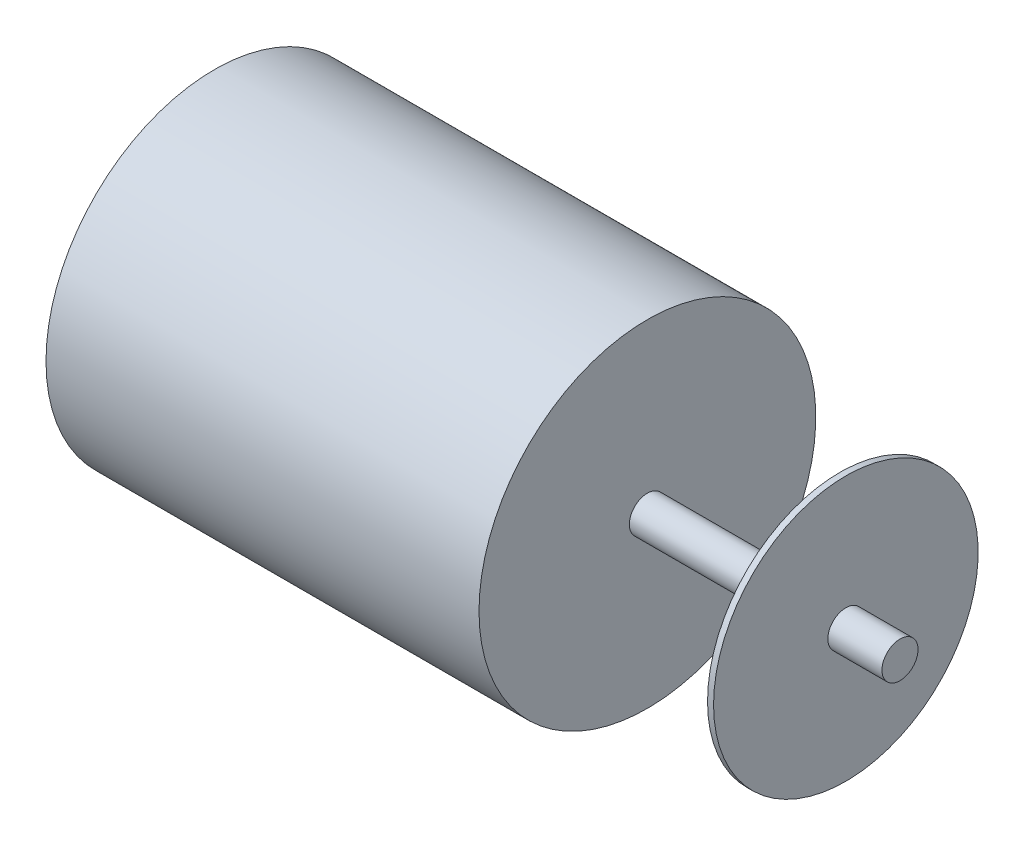
ISO-10303-21;
HEADER;
FILE_DESCRIPTION(('STEP AP214'),'2;1');
FILE_NAME('part.step','',(''),(''),'','','');
FILE_SCHEMA(('AUTOMOTIVE_DESIGN { 1 0 10303 214 1 1 1 1 }'));
ENDSEC;
DATA;
#1=APPLICATION_CONTEXT('core data for automotive mechanical design processes');
#2=APPLICATION_PROTOCOL_DEFINITION('international standard','automotive_design',2000,#1);
#3=PRODUCT_CONTEXT('',#1,'mechanical');
#4=PRODUCT('Part','Part','',(#3));
#5=PRODUCT_RELATED_PRODUCT_CATEGORY('part','',(#4));
#6=PRODUCT_DEFINITION_FORMATION('','',#4);
#7=PRODUCT_DEFINITION_CONTEXT('part definition',#1,'design');
#8=PRODUCT_DEFINITION('design','',#6,#7);
#9=PRODUCT_DEFINITION_SHAPE('','',#8);
#10=(LENGTH_UNIT() NAMED_UNIT(*) SI_UNIT(.MILLI.,.METRE.));
#11=(NAMED_UNIT(*) PLANE_ANGLE_UNIT() SI_UNIT($,.RADIAN.));
#12=(NAMED_UNIT(*) SI_UNIT($,.STERADIAN.) SOLID_ANGLE_UNIT());
#13=UNCERTAINTY_MEASURE_WITH_UNIT(LENGTH_MEASURE(1.E-05),#10,'distance_accuracy_value','');
#14=(GEOMETRIC_REPRESENTATION_CONTEXT(3) GLOBAL_UNCERTAINTY_ASSIGNED_CONTEXT((#13)) GLOBAL_UNIT_ASSIGNED_CONTEXT((#10,
#11,#12)) REPRESENTATION_CONTEXT('',''));
#15=CARTESIAN_POINT('',(0.,0.,0.));
#16=DIRECTION('',(0.,0.,1.));
#17=DIRECTION('',(1.,0.,0.));
#18=AXIS2_PLACEMENT_3D('',#15,#16,#17);
#19=CARTESIAN_POINT('',(0.,14.,0.));
#20=DIRECTION('',(1.,0.,0.));
#21=DIRECTION('',(0.,0.,-1.));
#22=AXIS2_PLACEMENT_3D('',#19,#20,#21);
#23=PLANE('',#22);
#24=CARTESIAN_POINT('',(0.,0.,0.));
#25=DIRECTION('',(-1.,0.,0.));
#26=DIRECTION('',(0.,0.,1.));
#27=AXIS2_PLACEMENT_3D('',#24,#25,#26);
#28=CIRCLE('',#27,14.);
#29=CARTESIAN_POINT('',(0.,0.,14.));
#30=VERTEX_POINT('',#29);
#31=EDGE_CURVE('E59',#30,#30,#28,.T.);
#32=ORIENTED_EDGE('',*,*,#31,.T.);
#33=EDGE_LOOP('',(#32));
#34=FACE_BOUND('',#33,.T.);
#35=ADVANCED_FACE('F31',(#34),#23,.F.);
#36=CARTESIAN_POINT('',(57.,0.,0.));
#37=DIRECTION('',(-1.,0.,0.));
#38=DIRECTION('',(0.,0.,1.));
#39=AXIS2_PLACEMENT_3D('',#36,#37,#38);
#40=PLANE('',#39);
#41=CARTESIAN_POINT('',(57.,0.,0.));
#42=DIRECTION('',(-1.,0.,0.));
#43=DIRECTION('',(0.,0.,1.));
#44=AXIS2_PLACEMENT_3D('',#41,#42,#43);
#45=CIRCLE('',#44,1.5);
#46=CARTESIAN_POINT('',(57.,0.,1.5));
#47=VERTEX_POINT('',#46);
#48=EDGE_CURVE('E10',#47,#47,#45,.T.);
#49=ORIENTED_EDGE('',*,*,#48,.F.);
#50=EDGE_LOOP('',(#49));
#51=FACE_BOUND('',#50,.T.);
#52=ADVANCED_FACE('F101',(#51),#40,.F.);
#53=CARTESIAN_POINT('',(0.,0.,0.));
#54=DIRECTION('',(-1.,0.,0.));
#55=DIRECTION('',(0.,0.,1.));
#56=AXIS2_PLACEMENT_3D('',#53,#54,#55);
#57=CYLINDRICAL_SURFACE('',#56,1.5);
#58=CARTESIAN_POINT('',(52.5,0.,0.));
#59=DIRECTION('',(-1.,0.,0.));
#60=DIRECTION('',(0.,0.,1.));
#61=AXIS2_PLACEMENT_3D('',#58,#59,#60);
#62=CIRCLE('',#61,1.5);
#63=CARTESIAN_POINT('',(52.5,0.,1.5));
#64=VERTEX_POINT('',#63);
#65=EDGE_CURVE('E37',#64,#64,#62,.T.);
#66=ORIENTED_EDGE('',*,*,#65,.F.);
#67=EDGE_LOOP('',(#66));
#68=FACE_BOUND('',#67,.T.);
#69=ORIENTED_EDGE('',*,*,#48,.T.);
#70=EDGE_LOOP('',(#69));
#71=FACE_BOUND('',#70,.T.);
#72=ADVANCED_FACE('F96',(#68,#71),#57,.T.);
#73=CARTESIAN_POINT('',(52.5,1.5,0.));
#74=DIRECTION('',(-1.,0.,0.));
#75=DIRECTION('',(0.,0.,1.));
#76=AXIS2_PLACEMENT_3D('',#73,#74,#75);
#77=PLANE('',#76);
#78=CARTESIAN_POINT('',(52.5,0.,0.));
#79=DIRECTION('',(-1.,0.,0.));
#80=DIRECTION('',(0.,0.,1.));
#81=AXIS2_PLACEMENT_3D('',#78,#79,#80);
#82=CIRCLE('',#81,11.);
#83=CARTESIAN_POINT('',(52.5,0.,11.));
#84=VERTEX_POINT('',#83);
#85=EDGE_CURVE('E41',#84,#84,#82,.T.);
#86=ORIENTED_EDGE('',*,*,#85,.F.);
#87=EDGE_LOOP('',(#86));
#88=FACE_BOUND('',#87,.T.);
#89=ORIENTED_EDGE('',*,*,#65,.T.);
#90=EDGE_LOOP('',(#89));
#91=FACE_BOUND('',#90,.T.);
#92=ADVANCED_FACE('F91',(#88,#91),#77,.F.);
#93=CARTESIAN_POINT('',(0.,0.,0.));
#94=DIRECTION('',(-1.,0.,0.));
#95=DIRECTION('',(0.,0.,1.));
#96=AXIS2_PLACEMENT_3D('',#93,#94,#95);
#97=CYLINDRICAL_SURFACE('',#96,11.);
#98=CARTESIAN_POINT('',(52.,0.,0.));
#99=DIRECTION('',(-1.,0.,0.));
#100=DIRECTION('',(0.,0.,1.));
#101=AXIS2_PLACEMENT_3D('',#98,#99,#100);
#102=CIRCLE('',#101,11.);
#103=CARTESIAN_POINT('',(52.,0.,11.));
#104=VERTEX_POINT('',#103);
#105=EDGE_CURVE('E45',#104,#104,#102,.T.);
#106=ORIENTED_EDGE('',*,*,#105,.F.);
#107=EDGE_LOOP('',(#106));
#108=FACE_BOUND('',#107,.T.);
#109=ORIENTED_EDGE('',*,*,#85,.T.);
#110=EDGE_LOOP('',(#109));
#111=FACE_BOUND('',#110,.T.);
#112=ADVANCED_FACE('F85',(#108,#111),#97,.T.);
#113=CARTESIAN_POINT('',(52.,11.,0.));
#114=DIRECTION('',(1.,0.,0.));
#115=DIRECTION('',(0.,0.,-1.));
#116=AXIS2_PLACEMENT_3D('',#113,#114,#115);
#117=PLANE('',#116);
#118=CARTESIAN_POINT('',(52.,0.,0.));
#119=DIRECTION('',(-1.,0.,0.));
#120=DIRECTION('',(0.,0.,1.));
#121=AXIS2_PLACEMENT_3D('',#118,#119,#120);
#122=CIRCLE('',#121,1.5);
#123=CARTESIAN_POINT('',(52.,0.,1.5));
#124=VERTEX_POINT('',#123);
#125=EDGE_CURVE('E50',#124,#124,#122,.T.);
#126=ORIENTED_EDGE('',*,*,#125,.F.);
#127=EDGE_LOOP('',(#126));
#128=FACE_BOUND('',#127,.T.);
#129=ORIENTED_EDGE('',*,*,#105,.T.);
#130=EDGE_LOOP('',(#129));
#131=FACE_BOUND('',#130,.T.);
#132=ADVANCED_FACE('F79',(#128,#131),#117,.F.);
#133=CARTESIAN_POINT('',(0.,0.,0.));
#134=DIRECTION('',(-1.,0.,0.));
#135=DIRECTION('',(0.,0.,1.));
#136=AXIS2_PLACEMENT_3D('',#133,#134,#135);
#137=CYLINDRICAL_SURFACE('',#136,1.5);
#138=CARTESIAN_POINT('',(36.,0.,0.));
#139=DIRECTION('',(-1.,0.,0.));
#140=DIRECTION('',(0.,0.,1.));
#141=AXIS2_PLACEMENT_3D('',#138,#139,#140);
#142=CIRCLE('',#141,1.5);
#143=CARTESIAN_POINT('',(36.,0.,1.5));
#144=VERTEX_POINT('',#143);
#145=EDGE_CURVE('E53',#144,#144,#142,.T.);
#146=ORIENTED_EDGE('',*,*,#145,.F.);
#147=EDGE_LOOP('',(#146));
#148=FACE_BOUND('',#147,.T.);
#149=ORIENTED_EDGE('',*,*,#125,.T.);
#150=EDGE_LOOP('',(#149));
#151=FACE_BOUND('',#150,.T.);
#152=ADVANCED_FACE('F73',(#148,#151),#137,.T.);
#153=CARTESIAN_POINT('',(36.,1.5,0.));
#154=DIRECTION('',(-1.,0.,0.));
#155=DIRECTION('',(0.,0.,1.));
#156=AXIS2_PLACEMENT_3D('',#153,#154,#155);
#157=PLANE('',#156);
#158=CARTESIAN_POINT('',(36.,0.,0.));
#159=DIRECTION('',(-1.,0.,0.));
#160=DIRECTION('',(0.,0.,1.));
#161=AXIS2_PLACEMENT_3D('',#158,#159,#160);
#162=CIRCLE('',#161,14.);
#163=CARTESIAN_POINT('',(36.,0.,14.));
#164=VERTEX_POINT('',#163);
#165=EDGE_CURVE('E56',#164,#164,#162,.T.);
#166=ORIENTED_EDGE('',*,*,#165,.F.);
#167=EDGE_LOOP('',(#166));
#168=FACE_BOUND('',#167,.T.);
#169=ORIENTED_EDGE('',*,*,#145,.T.);
#170=EDGE_LOOP('',(#169));
#171=FACE_BOUND('',#170,.T.);
#172=ADVANCED_FACE('F67',(#168,#171),#157,.F.);
#173=CARTESIAN_POINT('',(0.,0.,0.));
#174=DIRECTION('',(-1.,0.,0.));
#175=DIRECTION('',(0.,0.,1.));
#176=AXIS2_PLACEMENT_3D('',#173,#174,#175);
#177=CYLINDRICAL_SURFACE('',#176,14.);
#178=ORIENTED_EDGE('',*,*,#31,.F.);
#179=EDGE_LOOP('',(#178));
#180=FACE_BOUND('',#179,.T.);
#181=ORIENTED_EDGE('',*,*,#165,.T.);
#182=EDGE_LOOP('',(#181));
#183=FACE_BOUND('',#182,.T.);
#184=ADVANCED_FACE('F64',(#180,#183),#177,.T.);
#185=CLOSED_SHELL('',(#35,#52,#72,#92,#112,#132,#152,#172,#184));
#186=MANIFOLD_SOLID_BREP('B2',#185);
#187=ADVANCED_BREP_SHAPE_REPRESENTATION('',(#18,#186),#14);
#188=SHAPE_DEFINITION_REPRESENTATION(#9,#187);
ENDSEC;
END-ISO-10303-21;
